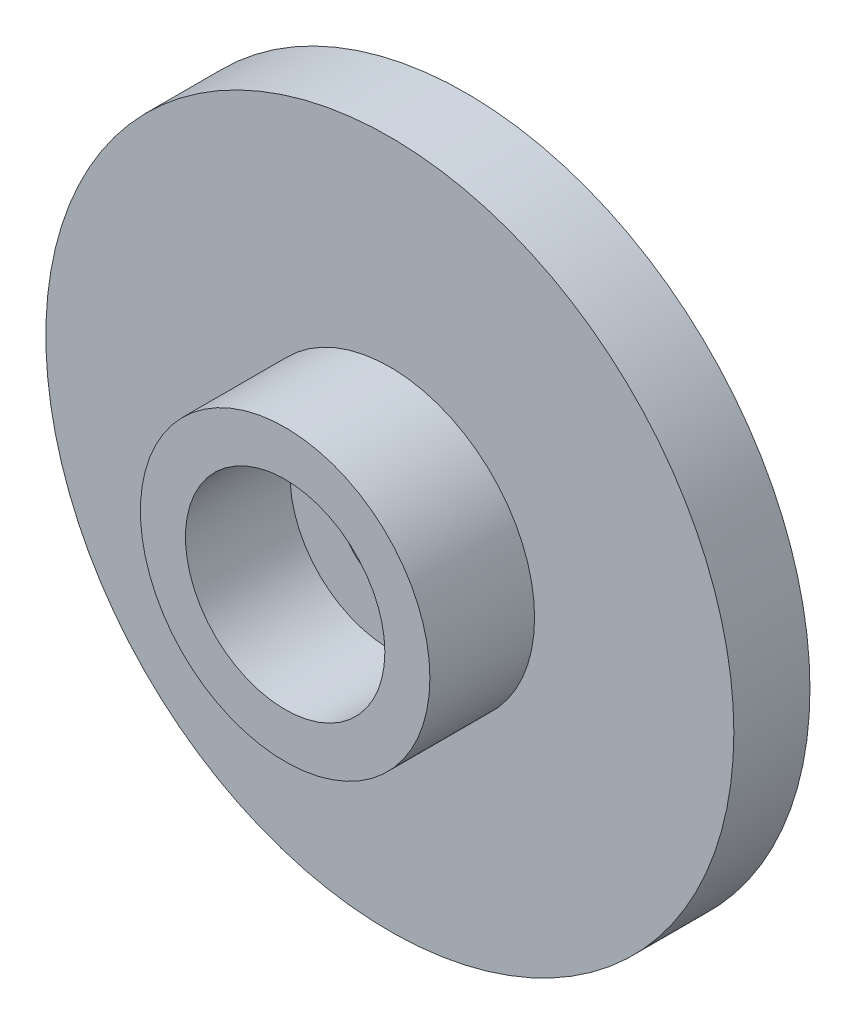
ISO-10303-21;
HEADER;
FILE_DESCRIPTION(('STEP AP214'),'2;1');
FILE_NAME('part.step','',(''),(''),'','','');
FILE_SCHEMA(('AUTOMOTIVE_DESIGN { 1 0 10303 214 1 1 1 1 }'));
ENDSEC;
DATA;
#1=APPLICATION_CONTEXT('core data for automotive mechanical design processes');
#2=APPLICATION_PROTOCOL_DEFINITION('international standard','automotive_design',2000,#1);
#3=PRODUCT_CONTEXT('',#1,'mechanical');
#4=PRODUCT('Part','Part','',(#3));
#5=PRODUCT_RELATED_PRODUCT_CATEGORY('part','',(#4));
#6=PRODUCT_DEFINITION_FORMATION('','',#4);
#7=PRODUCT_DEFINITION_CONTEXT('part definition',#1,'design');
#8=PRODUCT_DEFINITION('design','',#6,#7);
#9=PRODUCT_DEFINITION_SHAPE('','',#8);
#10=(LENGTH_UNIT() NAMED_UNIT(*) SI_UNIT(.MILLI.,.METRE.));
#11=(NAMED_UNIT(*) PLANE_ANGLE_UNIT() SI_UNIT($,.RADIAN.));
#12=(NAMED_UNIT(*) SI_UNIT($,.STERADIAN.) SOLID_ANGLE_UNIT());
#13=UNCERTAINTY_MEASURE_WITH_UNIT(LENGTH_MEASURE(1.E-05),#10,'distance_accuracy_value','');
#14=(GEOMETRIC_REPRESENTATION_CONTEXT(3) GLOBAL_UNCERTAINTY_ASSIGNED_CONTEXT((#13)) GLOBAL_UNIT_ASSIGNED_CONTEXT((#10,
#11,#12)) REPRESENTATION_CONTEXT('',''));
#15=CARTESIAN_POINT('',(0.,0.,0.));
#16=DIRECTION('',(0.,0.,1.));
#17=DIRECTION('',(1.,0.,0.));
#18=AXIS2_PLACEMENT_3D('',#15,#16,#17);
#19=CARTESIAN_POINT('',(0.,0.,2.29));
#20=DIRECTION('',(0.,0.,1.));
#21=DIRECTION('',(1.,0.,0.));
#22=AXIS2_PLACEMENT_3D('',#19,#20,#21);
#23=PLANE('',#22);
#24=CARTESIAN_POINT('',(0.,0.,2.29));
#25=DIRECTION('',(0.,0.,1.));
#26=DIRECTION('',(1.,0.,0.));
#27=AXIS2_PLACEMENT_3D('',#24,#25,#26);
#28=CIRCLE('',#27,10.35);
#29=CARTESIAN_POINT('',(10.35,0.,2.29));
#30=VERTEX_POINT('',#29);
#31=EDGE_CURVE('E10',#30,#30,#28,.T.);
#32=ORIENTED_EDGE('',*,*,#31,.T.);
#33=EDGE_LOOP('',(#32));
#34=FACE_BOUND('',#33,.T.);
#35=CARTESIAN_POINT('',(0.,0.,2.29));
#36=DIRECTION('',(0.,0.,1.));
#37=DIRECTION('',(1.,0.,0.));
#38=AXIS2_PLACEMENT_3D('',#35,#36,#37);
#39=CIRCLE('',#38,4.355);
#40=CARTESIAN_POINT('',(4.355,0.,2.29));
#41=VERTEX_POINT('',#40);
#42=EDGE_CURVE('E44',#41,#41,#39,.T.);
#43=ORIENTED_EDGE('',*,*,#42,.F.);
#44=EDGE_LOOP('',(#43));
#45=FACE_BOUND('',#44,.T.);
#46=ADVANCED_FACE('F31',(#34,#45),#23,.T.);
#47=CARTESIAN_POINT('',(0.,0.,2.29));
#48=DIRECTION('',(0.,0.,-1.));
#49=DIRECTION('',(-1.,0.,0.));
#50=AXIS2_PLACEMENT_3D('',#47,#48,#49);
#51=CYLINDRICAL_SURFACE('',#50,10.35);
#52=ORIENTED_EDGE('',*,*,#31,.F.);
#53=EDGE_LOOP('',(#52));
#54=FACE_BOUND('',#53,.T.);
#55=CARTESIAN_POINT('',(0.,0.,0.));
#56=DIRECTION('',(0.,0.,1.));
#57=DIRECTION('',(1.,0.,0.));
#58=AXIS2_PLACEMENT_3D('',#55,#56,#57);
#59=CIRCLE('',#58,10.35);
#60=CARTESIAN_POINT('',(10.35,0.,0.));
#61=VERTEX_POINT('',#60);
#62=EDGE_CURVE('E35',#61,#61,#59,.T.);
#63=ORIENTED_EDGE('',*,*,#62,.T.);
#64=EDGE_LOOP('',(#63));
#65=FACE_BOUND('',#64,.T.);
#66=ADVANCED_FACE('F33',(#54,#65),#51,.T.);
#67=CARTESIAN_POINT('',(0.,0.,0.));
#68=DIRECTION('',(0.,0.,1.));
#69=DIRECTION('',(1.,0.,0.));
#70=AXIS2_PLACEMENT_3D('',#67,#68,#69);
#71=PLANE('',#70);
#72=CARTESIAN_POINT('',(0.,0.,0.));
#73=DIRECTION('',(0.,0.,1.));
#74=DIRECTION('',(1.,0.,0.));
#75=AXIS2_PLACEMENT_3D('',#72,#73,#74);
#76=CIRCLE('',#75,1.5);
#77=CARTESIAN_POINT('',(1.5,0.,0.));
#78=VERTEX_POINT('',#77);
#79=EDGE_CURVE('E55',#78,#78,#76,.F.);
#80=ORIENTED_EDGE('',*,*,#79,.F.);
#81=EDGE_LOOP('',(#80));
#82=FACE_BOUND('',#81,.T.);
#83=ORIENTED_EDGE('',*,*,#62,.F.);
#84=EDGE_LOOP('',(#83));
#85=FACE_BOUND('',#84,.T.);
#86=ADVANCED_FACE('F85',(#82,#85),#71,.F.);
#87=CARTESIAN_POINT('',(0.,0.,5.44));
#88=DIRECTION('',(0.,0.,-1.));
#89=DIRECTION('',(-1.,0.,0.));
#90=AXIS2_PLACEMENT_3D('',#87,#88,#89);
#91=CYLINDRICAL_SURFACE('',#90,4.355);
#92=CARTESIAN_POINT('',(0.,0.,5.44));
#93=DIRECTION('',(0.,0.,1.));
#94=DIRECTION('',(1.,0.,0.));
#95=AXIS2_PLACEMENT_3D('',#92,#93,#94);
#96=CIRCLE('',#95,4.355);
#97=CARTESIAN_POINT('',(4.355,0.,5.44));
#98=VERTEX_POINT('',#97);
#99=EDGE_CURVE('E42',#98,#98,#96,.T.);
#100=ORIENTED_EDGE('',*,*,#99,.F.);
#101=EDGE_LOOP('',(#100));
#102=FACE_BOUND('',#101,.T.);
#103=ORIENTED_EDGE('',*,*,#42,.T.);
#104=EDGE_LOOP('',(#103));
#105=FACE_BOUND('',#104,.T.);
#106=ADVANCED_FACE('F79',(#102,#105),#91,.T.);
#107=CARTESIAN_POINT('',(0.,0.,5.44));
#108=DIRECTION('',(0.,0.,1.));
#109=DIRECTION('',(1.,0.,0.));
#110=AXIS2_PLACEMENT_3D('',#107,#108,#109);
#111=PLANE('',#110);
#112=CARTESIAN_POINT('',(0.,0.,5.44));
#113=DIRECTION('',(0.,0.,1.));
#114=DIRECTION('',(1.,0.,0.));
#115=AXIS2_PLACEMENT_3D('',#112,#113,#114);
#116=CIRCLE('',#115,3.);
#117=CARTESIAN_POINT('',(3.,0.,5.44));
#118=VERTEX_POINT('',#117);
#119=EDGE_CURVE('E52',#118,#118,#116,.T.);
#120=ORIENTED_EDGE('',*,*,#119,.F.);
#121=EDGE_LOOP('',(#120));
#122=FACE_BOUND('',#121,.T.);
#123=ORIENTED_EDGE('',*,*,#99,.T.);
#124=EDGE_LOOP('',(#123));
#125=FACE_BOUND('',#124,.T.);
#126=ADVANCED_FACE('F73',(#122,#125),#111,.T.);
#127=CARTESIAN_POINT('',(0.,0.,-6.19528137423857));
#128=DIRECTION('',(0.,0.,1.));
#129=DIRECTION('',(1.,0.,0.));
#130=AXIS2_PLACEMENT_3D('',#127,#128,#129);
#131=CYLINDRICAL_SURFACE('',#130,3.);
#132=CARTESIAN_POINT('',(0.,0.,2.29));
#133=DIRECTION('',(0.,0.,1.));
#134=DIRECTION('',(1.,0.,0.));
#135=AXIS2_PLACEMENT_3D('',#132,#133,#134);
#136=CIRCLE('',#135,3.);
#137=CARTESIAN_POINT('',(3.,0.,2.29));
#138=VERTEX_POINT('',#137);
#139=EDGE_CURVE('E47',#138,#138,#136,.F.);
#140=ORIENTED_EDGE('',*,*,#139,.T.);
#141=EDGE_LOOP('',(#140));
#142=FACE_BOUND('',#141,.T.);
#143=ORIENTED_EDGE('',*,*,#119,.T.);
#144=EDGE_LOOP('',(#143));
#145=FACE_BOUND('',#144,.T.);
#146=ADVANCED_FACE('F67',(#142,#145),#131,.F.);
#147=CARTESIAN_POINT('',(0.,0.,2.29));
#148=DIRECTION('',(0.,0.,1.));
#149=DIRECTION('',(1.,0.,0.));
#150=AXIS2_PLACEMENT_3D('',#147,#148,#149);
#151=PLANE('',#150);
#152=CARTESIAN_POINT('',(0.,0.,2.29));
#153=DIRECTION('',(0.,0.,1.));
#154=DIRECTION('',(1.,0.,0.));
#155=AXIS2_PLACEMENT_3D('',#152,#153,#154);
#156=CIRCLE('',#155,1.5);
#157=CARTESIAN_POINT('',(1.5,0.,2.29));
#158=VERTEX_POINT('',#157);
#159=EDGE_CURVE('E58',#158,#158,#156,.T.);
#160=ORIENTED_EDGE('',*,*,#159,.F.);
#161=EDGE_LOOP('',(#160));
#162=FACE_BOUND('',#161,.T.);
#163=ORIENTED_EDGE('',*,*,#139,.F.);
#164=EDGE_LOOP('',(#163));
#165=FACE_BOUND('',#164,.T.);
#166=ADVANCED_FACE('F64',(#162,#165),#151,.T.);
#167=CARTESIAN_POINT('',(0.,0.,-4.24264068711929));
#168=DIRECTION('',(0.,0.,1.));
#169=DIRECTION('',(1.,0.,0.));
#170=AXIS2_PLACEMENT_3D('',#167,#168,#169);
#171=CYLINDRICAL_SURFACE('',#170,1.5);
#172=ORIENTED_EDGE('',*,*,#79,.T.);
#173=EDGE_LOOP('',(#172));
#174=FACE_BOUND('',#173,.T.);
#175=ORIENTED_EDGE('',*,*,#159,.T.);
#176=EDGE_LOOP('',(#175));
#177=FACE_BOUND('',#176,.T.);
#178=ADVANCED_FACE('F62',(#174,#177),#171,.F.);
#179=CLOSED_SHELL('',(#46,#66,#86,#106,#126,#146,#166,#178));
#180=MANIFOLD_SOLID_BREP('B2',#179);
#181=ADVANCED_BREP_SHAPE_REPRESENTATION('',(#18,#180),#14);
#182=SHAPE_DEFINITION_REPRESENTATION(#9,#181);
ENDSEC;
END-ISO-10303-21;
